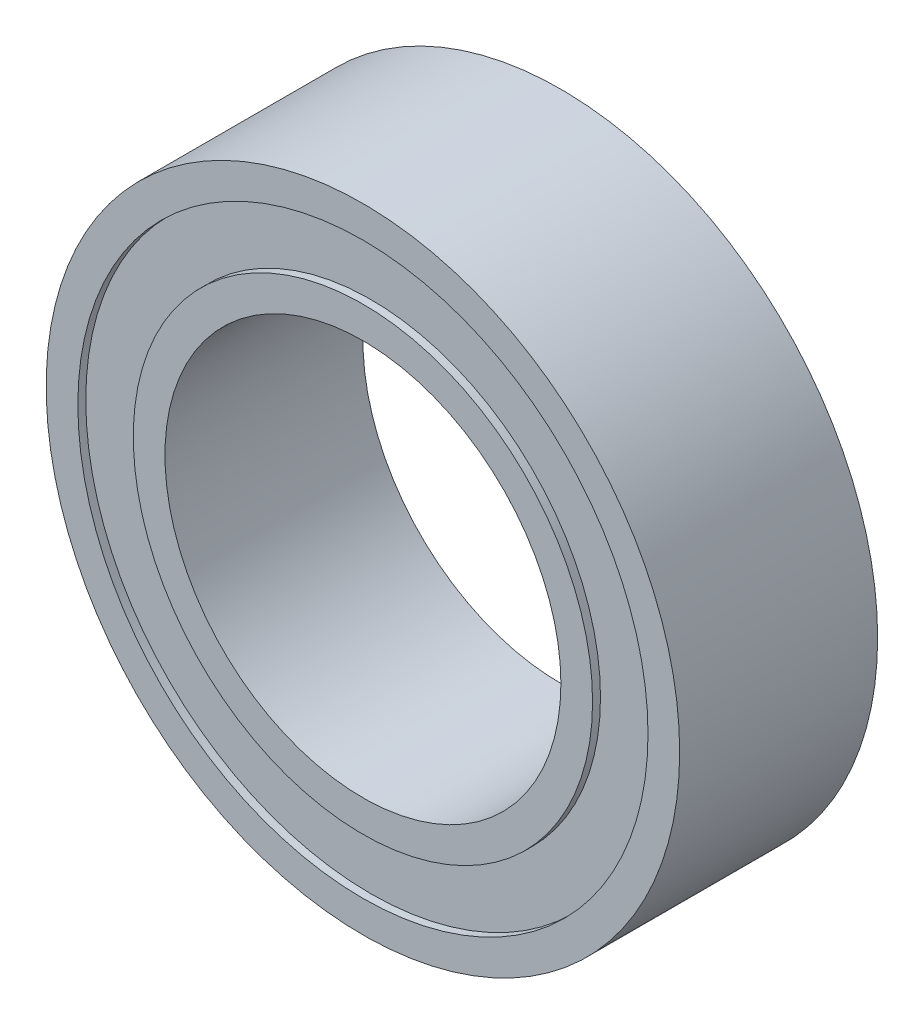
ISO-10303-21;
HEADER;
FILE_DESCRIPTION(('STEP AP214'),'2;1');
FILE_NAME('part.step','',(''),(''),'','','');
FILE_SCHEMA(('AUTOMOTIVE_DESIGN { 1 0 10303 214 1 1 1 1 }'));
ENDSEC;
DATA;
#1=APPLICATION_CONTEXT('core data for automotive mechanical design processes');
#2=APPLICATION_PROTOCOL_DEFINITION('international standard','automotive_design',2000,#1);
#3=PRODUCT_CONTEXT('',#1,'mechanical');
#4=PRODUCT('Part','Part','',(#3));
#5=PRODUCT_RELATED_PRODUCT_CATEGORY('part','',(#4));
#6=PRODUCT_DEFINITION_FORMATION('','',#4);
#7=PRODUCT_DEFINITION_CONTEXT('part definition',#1,'design');
#8=PRODUCT_DEFINITION('design','',#6,#7);
#9=PRODUCT_DEFINITION_SHAPE('','',#8);
#10=(LENGTH_UNIT() NAMED_UNIT(*) SI_UNIT(.MILLI.,.METRE.));
#11=(NAMED_UNIT(*) PLANE_ANGLE_UNIT() SI_UNIT($,.RADIAN.));
#12=(NAMED_UNIT(*) SI_UNIT($,.STERADIAN.) SOLID_ANGLE_UNIT());
#13=UNCERTAINTY_MEASURE_WITH_UNIT(LENGTH_MEASURE(1.E-05),#10,'distance_accuracy_value','');
#14=(GEOMETRIC_REPRESENTATION_CONTEXT(3) GLOBAL_UNCERTAINTY_ASSIGNED_CONTEXT((#13)) GLOBAL_UNIT_ASSIGNED_CONTEXT((#10,
#11,#12)) REPRESENTATION_CONTEXT('',''));
#15=CARTESIAN_POINT('',(0.,0.,0.));
#16=DIRECTION('',(0.,0.,1.));
#17=DIRECTION('',(1.,0.,0.));
#18=AXIS2_PLACEMENT_3D('',#15,#16,#17);
#19=CARTESIAN_POINT('',(0.,0.,2.5));
#20=DIRECTION('',(0.,0.,-1.));
#21=DIRECTION('',(-1.,0.,0.));
#22=AXIS2_PLACEMENT_3D('',#19,#20,#21);
#23=CYLINDRICAL_SURFACE('',#22,2.9);
#24=CARTESIAN_POINT('',(0.,0.,0.));
#25=DIRECTION('',(0.,0.,1.));
#26=DIRECTION('',(1.,0.,0.));
#27=AXIS2_PLACEMENT_3D('',#24,#25,#26);
#28=CIRCLE('',#27,2.9);
#29=CARTESIAN_POINT('',(2.9,0.,0.));
#30=VERTEX_POINT('',#29);
#31=EDGE_CURVE('E53',#30,#30,#28,.T.);
#32=ORIENTED_EDGE('',*,*,#31,.T.);
#33=EDGE_LOOP('',(#32));
#34=FACE_BOUND('',#33,.T.);
#35=CARTESIAN_POINT('',(0.,0.,0.2));
#36=DIRECTION('',(0.,0.,1.));
#37=DIRECTION('',(1.,0.,0.));
#38=AXIS2_PLACEMENT_3D('',#35,#36,#37);
#39=CIRCLE('',#38,2.9);
#40=CARTESIAN_POINT('',(2.9,0.,0.2));
#41=VERTEX_POINT('',#40);
#42=EDGE_CURVE('E11',#41,#41,#39,.T.);
#43=ORIENTED_EDGE('',*,*,#42,.F.);
#44=EDGE_LOOP('',(#43));
#45=FACE_BOUND('',#44,.T.);
#46=ADVANCED_FACE('F37',(#34,#45),#23,.T.);
#47=CARTESIAN_POINT('',(0.,0.,2.5));
#48=DIRECTION('',(0.,0.,-1.));
#49=DIRECTION('',(-1.,0.,0.));
#50=AXIS2_PLACEMENT_3D('',#47,#48,#49);
#51=CYLINDRICAL_SURFACE('',#50,2.5);
#52=CARTESIAN_POINT('',(0.,0.,2.5));
#53=DIRECTION('',(0.,0.,1.));
#54=DIRECTION('',(1.,0.,0.));
#55=AXIS2_PLACEMENT_3D('',#52,#53,#54);
#56=CIRCLE('',#55,2.5);
#57=CARTESIAN_POINT('',(2.5,0.,2.5));
#58=VERTEX_POINT('',#57);
#59=EDGE_CURVE('E48',#58,#58,#56,.T.);
#60=ORIENTED_EDGE('',*,*,#59,.T.);
#61=EDGE_LOOP('',(#60));
#62=FACE_BOUND('',#61,.T.);
#63=CARTESIAN_POINT('',(0.,0.,0.));
#64=DIRECTION('',(0.,0.,1.));
#65=DIRECTION('',(1.,0.,0.));
#66=AXIS2_PLACEMENT_3D('',#63,#64,#65);
#67=CIRCLE('',#66,2.5);
#68=CARTESIAN_POINT('',(2.5,0.,0.));
#69=VERTEX_POINT('',#68);
#70=EDGE_CURVE('E57',#69,#69,#67,.T.);
#71=ORIENTED_EDGE('',*,*,#70,.F.);
#72=EDGE_LOOP('',(#71));
#73=FACE_BOUND('',#72,.T.);
#74=ADVANCED_FACE('F39',(#62,#73),#51,.F.);
#75=CARTESIAN_POINT('',(0.,0.,2.4));
#76=DIRECTION('',(0.,0.,1.));
#77=DIRECTION('',(1.,0.,0.));
#78=AXIS2_PLACEMENT_3D('',#75,#76,#77);
#79=CIRCLE('',#78,2.9);
#80=CARTESIAN_POINT('',(2.9,0.,2.4));
#81=VERTEX_POINT('',#80);
#82=EDGE_CURVE('E59',#81,#81,#79,.T.);
#83=ORIENTED_EDGE('',*,*,#82,.T.);
#84=EDGE_LOOP('',(#83));
#85=FACE_BOUND('',#84,.T.);
#86=CARTESIAN_POINT('',(0.,0.,2.5));
#87=DIRECTION('',(0.,0.,1.));
#88=DIRECTION('',(1.,0.,0.));
#89=AXIS2_PLACEMENT_3D('',#86,#87,#88);
#90=CIRCLE('',#89,2.9);
#91=CARTESIAN_POINT('',(2.9,0.,2.5));
#92=VERTEX_POINT('',#91);
#93=EDGE_CURVE('E44',#92,#92,#90,.T.);
#94=ORIENTED_EDGE('',*,*,#93,.F.);
#95=EDGE_LOOP('',(#94));
#96=FACE_BOUND('',#95,.T.);
#97=ADVANCED_FACE('F78',(#85,#96),#23,.T.);
#98=CARTESIAN_POINT('',(0.,0.,2.5));
#99=DIRECTION('',(0.,0.,1.));
#100=DIRECTION('',(1.,0.,0.));
#101=AXIS2_PLACEMENT_3D('',#98,#99,#100);
#102=PLANE('',#101);
#103=ORIENTED_EDGE('',*,*,#59,.F.);
#104=EDGE_LOOP('',(#103));
#105=FACE_BOUND('',#104,.T.);
#106=ORIENTED_EDGE('',*,*,#93,.T.);
#107=EDGE_LOOP('',(#106));
#108=FACE_BOUND('',#107,.T.);
#109=ADVANCED_FACE('F68',(#105,#108),#102,.T.);
#110=CARTESIAN_POINT('',(0.,0.,0.));
#111=DIRECTION('',(0.,0.,1.));
#112=DIRECTION('',(1.,0.,0.));
#113=AXIS2_PLACEMENT_3D('',#110,#111,#112);
#114=PLANE('',#113);
#115=ORIENTED_EDGE('',*,*,#70,.T.);
#116=EDGE_LOOP('',(#115));
#117=FACE_BOUND('',#116,.T.);
#118=ORIENTED_EDGE('',*,*,#31,.F.);
#119=EDGE_LOOP('',(#118));
#120=FACE_BOUND('',#119,.T.);
#121=ADVANCED_FACE('F65',(#117,#120),#114,.F.);
#122=CARTESIAN_POINT('',(0.,0.,2.4));
#123=DIRECTION('',(0.,0.,1.));
#124=DIRECTION('',(1.,0.,0.));
#125=AXIS2_PLACEMENT_3D('',#122,#123,#124);
#126=PLANE('',#125);
#127=ORIENTED_EDGE('',*,*,#82,.F.);
#128=EDGE_LOOP('',(#127));
#129=FACE_BOUND('',#128,.T.);
#130=CARTESIAN_POINT('',(0.,0.,2.4));
#131=DIRECTION('',(0.,0.,1.));
#132=DIRECTION('',(1.,0.,0.));
#133=AXIS2_PLACEMENT_3D('',#130,#131,#132);
#134=CIRCLE('',#133,3.6);
#135=CARTESIAN_POINT('',(3.6,0.,2.4));
#136=VERTEX_POINT('',#135);
#137=EDGE_CURVE('E96',#136,#136,#134,.F.);
#138=ORIENTED_EDGE('',*,*,#137,.F.);
#139=EDGE_LOOP('',(#138));
#140=FACE_BOUND('',#139,.T.);
#141=ADVANCED_FACE('F67',(#129,#140),#126,.T.);
#142=CARTESIAN_POINT('',(0.,0.,0.2));
#143=DIRECTION('',(0.,0.,1.));
#144=DIRECTION('',(1.,0.,0.));
#145=AXIS2_PLACEMENT_3D('',#142,#143,#144);
#146=PLANE('',#145);
#147=ORIENTED_EDGE('',*,*,#42,.T.);
#148=EDGE_LOOP('',(#147));
#149=FACE_BOUND('',#148,.T.);
#150=CARTESIAN_POINT('',(0.,0.,0.2));
#151=DIRECTION('',(0.,0.,1.));
#152=DIRECTION('',(1.,0.,0.));
#153=AXIS2_PLACEMENT_3D('',#150,#151,#152);
#154=CIRCLE('',#153,3.6);
#155=CARTESIAN_POINT('',(3.6,0.,0.2));
#156=VERTEX_POINT('',#155);
#157=EDGE_CURVE('E93',#156,#156,#154,.T.);
#158=ORIENTED_EDGE('',*,*,#157,.F.);
#159=EDGE_LOOP('',(#158));
#160=FACE_BOUND('',#159,.T.);
#161=ADVANCED_FACE('F75',(#149,#160),#146,.F.);
#162=CARTESIAN_POINT('',(0.,0.,2.5));
#163=DIRECTION('',(0.,0.,-1.));
#164=DIRECTION('',(-1.,0.,0.));
#165=AXIS2_PLACEMENT_3D('',#162,#163,#164);
#166=CYLINDRICAL_SURFACE('',#165,3.6);
#167=CARTESIAN_POINT('',(0.,0.,0.));
#168=DIRECTION('',(0.,0.,1.));
#169=DIRECTION('',(1.,0.,0.));
#170=AXIS2_PLACEMENT_3D('',#167,#168,#169);
#171=CIRCLE('',#170,3.6);
#172=CARTESIAN_POINT('',(3.6,0.,0.));
#173=VERTEX_POINT('',#172);
#174=EDGE_CURVE('E105',#173,#173,#171,.T.);
#175=ORIENTED_EDGE('',*,*,#174,.F.);
#176=EDGE_LOOP('',(#175));
#177=FACE_BOUND('',#176,.T.);
#178=ORIENTED_EDGE('',*,*,#157,.T.);
#179=EDGE_LOOP('',(#178));
#180=FACE_BOUND('',#179,.T.);
#181=ADVANCED_FACE('F135',(#177,#180),#166,.F.);
#182=ORIENTED_EDGE('',*,*,#137,.T.);
#183=EDGE_LOOP('',(#182));
#184=FACE_BOUND('',#183,.T.);
#185=CARTESIAN_POINT('',(0.,0.,2.5));
#186=DIRECTION('',(0.,0.,1.));
#187=DIRECTION('',(1.,0.,0.));
#188=AXIS2_PLACEMENT_3D('',#185,#186,#187);
#189=CIRCLE('',#188,3.6);
#190=CARTESIAN_POINT('',(3.6,0.,2.5));
#191=VERTEX_POINT('',#190);
#192=EDGE_CURVE('E104',#191,#191,#189,.T.);
#193=ORIENTED_EDGE('',*,*,#192,.T.);
#194=EDGE_LOOP('',(#193));
#195=FACE_BOUND('',#194,.T.);
#196=ADVANCED_FACE('F113',(#184,#195),#166,.F.);
#197=CARTESIAN_POINT('',(0.,0.,2.5));
#198=DIRECTION('',(0.,0.,-1.));
#199=DIRECTION('',(-1.,0.,0.));
#200=AXIS2_PLACEMENT_3D('',#197,#198,#199);
#201=CYLINDRICAL_SURFACE('',#200,4.);
#202=CARTESIAN_POINT('',(0.,0.,2.5));
#203=DIRECTION('',(0.,0.,1.));
#204=DIRECTION('',(1.,0.,0.));
#205=AXIS2_PLACEMENT_3D('',#202,#203,#204);
#206=CIRCLE('',#205,4.);
#207=CARTESIAN_POINT('',(4.,0.,2.5));
#208=VERTEX_POINT('',#207);
#209=EDGE_CURVE('E100',#208,#208,#206,.T.);
#210=ORIENTED_EDGE('',*,*,#209,.F.);
#211=EDGE_LOOP('',(#210));
#212=FACE_BOUND('',#211,.T.);
#213=CARTESIAN_POINT('',(0.,0.,0.));
#214=DIRECTION('',(0.,0.,1.));
#215=DIRECTION('',(1.,0.,0.));
#216=AXIS2_PLACEMENT_3D('',#213,#214,#215);
#217=CIRCLE('',#216,4.);
#218=CARTESIAN_POINT('',(4.,0.,0.));
#219=VERTEX_POINT('',#218);
#220=EDGE_CURVE('E101',#219,#219,#217,.T.);
#221=ORIENTED_EDGE('',*,*,#220,.T.);
#222=EDGE_LOOP('',(#221));
#223=FACE_BOUND('',#222,.T.);
#224=ADVANCED_FACE('F119',(#212,#223),#201,.T.);
#225=CARTESIAN_POINT('',(0.,0.,2.5));
#226=DIRECTION('',(0.,0.,1.));
#227=DIRECTION('',(1.,0.,0.));
#228=AXIS2_PLACEMENT_3D('',#225,#226,#227);
#229=PLANE('',#228);
#230=ORIENTED_EDGE('',*,*,#192,.F.);
#231=EDGE_LOOP('',(#230));
#232=FACE_BOUND('',#231,.T.);
#233=ORIENTED_EDGE('',*,*,#209,.T.);
#234=EDGE_LOOP('',(#233));
#235=FACE_BOUND('',#234,.T.);
#236=ADVANCED_FACE('F115',(#232,#235),#229,.T.);
#237=CARTESIAN_POINT('',(0.,0.,0.));
#238=DIRECTION('',(0.,0.,1.));
#239=DIRECTION('',(1.,0.,0.));
#240=AXIS2_PLACEMENT_3D('',#237,#238,#239);
#241=PLANE('',#240);
#242=ORIENTED_EDGE('',*,*,#174,.T.);
#243=EDGE_LOOP('',(#242));
#244=FACE_BOUND('',#243,.T.);
#245=ORIENTED_EDGE('',*,*,#220,.F.);
#246=EDGE_LOOP('',(#245));
#247=FACE_BOUND('',#246,.T.);
#248=ADVANCED_FACE('F118',(#244,#247),#241,.F.);
#249=CLOSED_SHELL('',(#46,#74,#97,#109,#121,#141,#161,#181,#196,#224,#236,#248));
#250=MANIFOLD_SOLID_BREP('B2',#249);
#251=ADVANCED_BREP_SHAPE_REPRESENTATION('',(#18,#250),#14);
#252=SHAPE_DEFINITION_REPRESENTATION(#9,#251);
ENDSEC;
END-ISO-10303-21;
